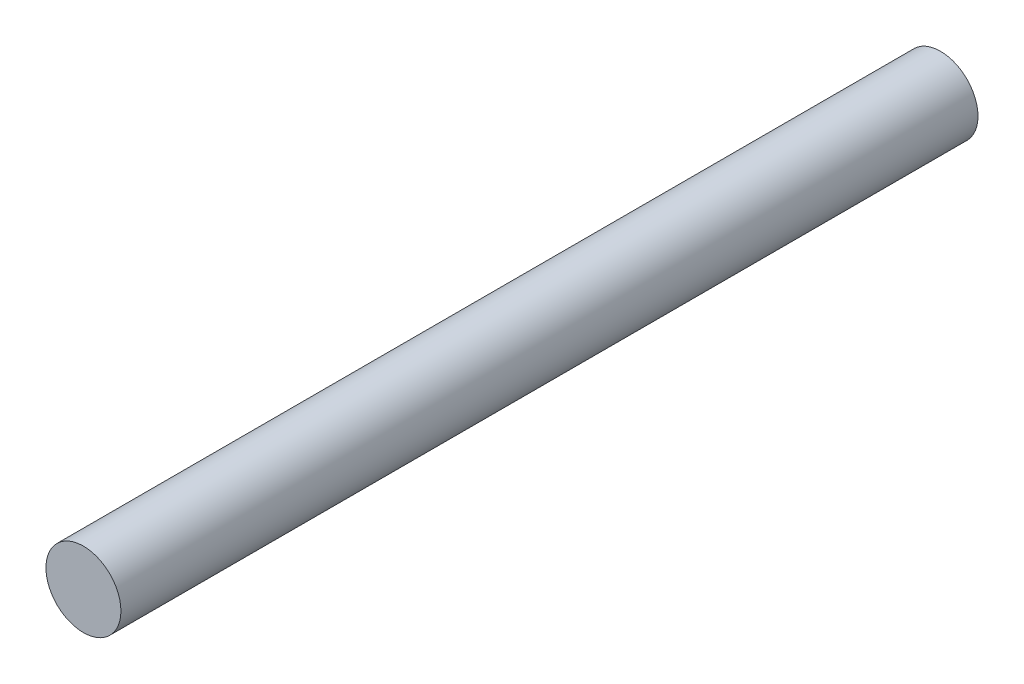
ISO-10303-21;
HEADER;
FILE_DESCRIPTION(('STEP AP214'),'2;1');
FILE_NAME('part.step','',(''),(''),'','','');
FILE_SCHEMA(('AUTOMOTIVE_DESIGN { 1 0 10303 214 1 1 1 1 }'));
ENDSEC;
DATA;
#1=APPLICATION_CONTEXT('core data for automotive mechanical design processes');
#2=APPLICATION_PROTOCOL_DEFINITION('international standard','automotive_design',2000,#1);
#3=PRODUCT_CONTEXT('',#1,'mechanical');
#4=PRODUCT('Part','Part','',(#3));
#5=PRODUCT_RELATED_PRODUCT_CATEGORY('part','',(#4));
#6=PRODUCT_DEFINITION_FORMATION('','',#4);
#7=PRODUCT_DEFINITION_CONTEXT('part definition',#1,'design');
#8=PRODUCT_DEFINITION('design','',#6,#7);
#9=PRODUCT_DEFINITION_SHAPE('','',#8);
#10=(LENGTH_UNIT() NAMED_UNIT(*) SI_UNIT(.MILLI.,.METRE.));
#11=(NAMED_UNIT(*) PLANE_ANGLE_UNIT() SI_UNIT($,.RADIAN.));
#12=(NAMED_UNIT(*) SI_UNIT($,.STERADIAN.) SOLID_ANGLE_UNIT());
#13=UNCERTAINTY_MEASURE_WITH_UNIT(LENGTH_MEASURE(1.E-05),#10,'distance_accuracy_value','');
#14=(GEOMETRIC_REPRESENTATION_CONTEXT(3) GLOBAL_UNCERTAINTY_ASSIGNED_CONTEXT((#13)) GLOBAL_UNIT_ASSIGNED_CONTEXT((#10,
#11,#12)) REPRESENTATION_CONTEXT('',''));
#15=CARTESIAN_POINT('',(0.,0.,0.));
#16=DIRECTION('',(0.,0.,1.));
#17=DIRECTION('',(1.,0.,0.));
#18=AXIS2_PLACEMENT_3D('',#15,#16,#17);
#19=CARTESIAN_POINT('',(0.,0.,203.2));
#20=DIRECTION('',(0.,0.,-1.));
#21=DIRECTION('',(-1.,0.,0.));
#22=AXIS2_PLACEMENT_3D('',#19,#20,#21);
#23=CYLINDRICAL_SURFACE('',#22,5.);
#24=CARTESIAN_POINT('',(0.,0.,203.2));
#25=DIRECTION('',(0.,0.,1.));
#26=DIRECTION('',(1.,0.,0.));
#27=AXIS2_PLACEMENT_3D('',#24,#25,#26);
#28=CIRCLE('',#27,5.);
#29=CARTESIAN_POINT('',(5.,0.,203.2));
#30=VERTEX_POINT('',#29);
#31=EDGE_CURVE('E10',#30,#30,#28,.T.);
#32=ORIENTED_EDGE('',*,*,#31,.F.);
#33=EDGE_LOOP('',(#32));
#34=FACE_BOUND('',#33,.T.);
#35=CARTESIAN_POINT('',(0.,0.,88.9));
#36=DIRECTION('',(0.,0.,1.));
#37=DIRECTION('',(1.,0.,0.));
#38=AXIS2_PLACEMENT_3D('',#35,#36,#37);
#39=CIRCLE('',#38,5.);
#40=CARTESIAN_POINT('',(5.,0.,88.9));
#41=VERTEX_POINT('',#40);
#42=EDGE_CURVE('E33',#41,#41,#39,.T.);
#43=ORIENTED_EDGE('',*,*,#42,.T.);
#44=EDGE_LOOP('',(#43));
#45=FACE_BOUND('',#44,.T.);
#46=ADVANCED_FACE('F30',(#34,#45),#23,.T.);
#47=CARTESIAN_POINT('',(0.,0.,203.2));
#48=DIRECTION('',(0.,0.,1.));
#49=DIRECTION('',(1.,0.,0.));
#50=AXIS2_PLACEMENT_3D('',#47,#48,#49);
#51=PLANE('',#50);
#52=ORIENTED_EDGE('',*,*,#31,.T.);
#53=EDGE_LOOP('',(#52));
#54=FACE_BOUND('',#53,.T.);
#55=ADVANCED_FACE('F45',(#54),#51,.T.);
#56=CARTESIAN_POINT('',(0.,0.,88.9));
#57=DIRECTION('',(0.,0.,1.));
#58=DIRECTION('',(1.,0.,0.));
#59=AXIS2_PLACEMENT_3D('',#56,#57,#58);
#60=PLANE('',#59);
#61=ORIENTED_EDGE('',*,*,#42,.F.);
#62=EDGE_LOOP('',(#61));
#63=FACE_BOUND('',#62,.T.);
#64=ADVANCED_FACE('F43',(#63),#60,.F.);
#65=CLOSED_SHELL('',(#46,#55,#64));
#66=MANIFOLD_SOLID_BREP('B2',#65);
#67=ADVANCED_BREP_SHAPE_REPRESENTATION('',(#18,#66),#14);
#68=SHAPE_DEFINITION_REPRESENTATION(#9,#67);
ENDSEC;
END-ISO-10303-21;
